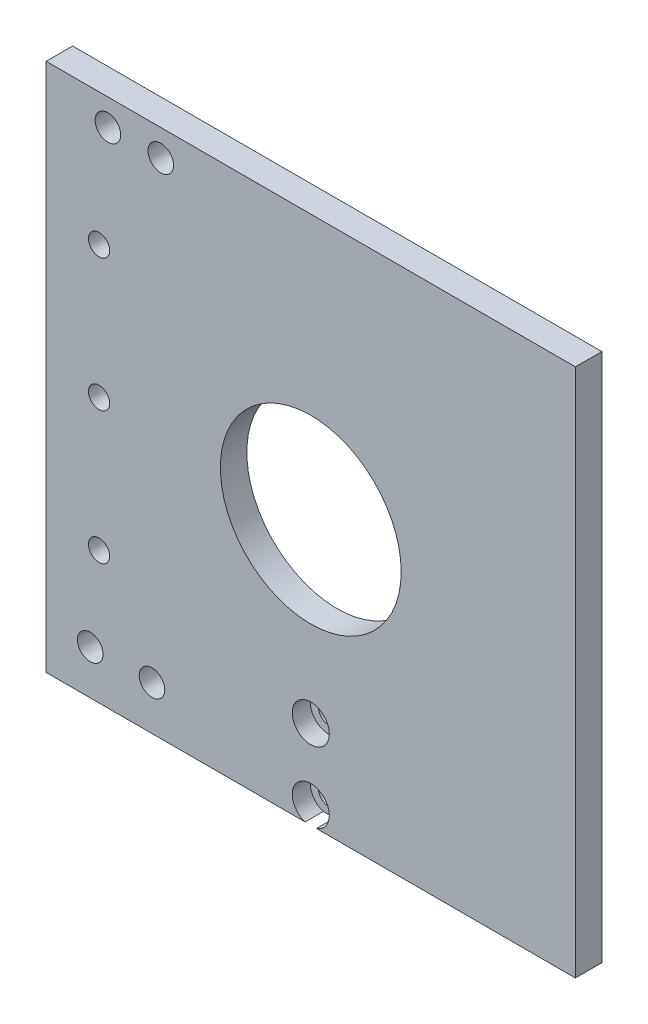
ISO-10303-21;
HEADER;
FILE_DESCRIPTION(('STEP AP214'),'2;1');
FILE_NAME('part.step','',(''),(''),'','','');
FILE_SCHEMA(('AUTOMOTIVE_DESIGN { 1 0 10303 214 1 1 1 1 }'));
ENDSEC;
DATA;
#1=APPLICATION_CONTEXT('core data for automotive mechanical design processes');
#2=APPLICATION_PROTOCOL_DEFINITION('international standard','automotive_design',2000,#1);
#3=PRODUCT_CONTEXT('',#1,'mechanical');
#4=PRODUCT('Part','Part','',(#3));
#5=PRODUCT_RELATED_PRODUCT_CATEGORY('part','',(#4));
#6=PRODUCT_DEFINITION_FORMATION('','',#4);
#7=PRODUCT_DEFINITION_CONTEXT('part definition',#1,'design');
#8=PRODUCT_DEFINITION('design','',#6,#7);
#9=PRODUCT_DEFINITION_SHAPE('','',#8);
#10=(LENGTH_UNIT() NAMED_UNIT(*) SI_UNIT(.MILLI.,.METRE.));
#11=(NAMED_UNIT(*) PLANE_ANGLE_UNIT() SI_UNIT($,.RADIAN.));
#12=(NAMED_UNIT(*) SI_UNIT($,.STERADIAN.) SOLID_ANGLE_UNIT());
#13=UNCERTAINTY_MEASURE_WITH_UNIT(LENGTH_MEASURE(1.E-05),#10,'distance_accuracy_value','');
#14=(GEOMETRIC_REPRESENTATION_CONTEXT(3) GLOBAL_UNCERTAINTY_ASSIGNED_CONTEXT((#13)) GLOBAL_UNIT_ASSIGNED_CONTEXT((#10,
#11,#12)) REPRESENTATION_CONTEXT('',''));
#15=CARTESIAN_POINT('',(0.,0.,0.));
#16=DIRECTION('',(0.,0.,1.));
#17=DIRECTION('',(1.,0.,0.));
#18=AXIS2_PLACEMENT_3D('',#15,#16,#17);
#19=CARTESIAN_POINT('',(1.11022302462516E-13,-20.,-0.01));
#20=DIRECTION('',(0.,0.,1.));
#21=DIRECTION('',(1.,0.,0.));
#22=AXIS2_PLACEMENT_3D('',#19,#20,#21);
#23=CYLINDRICAL_SURFACE('',#22,1.2);
#24=CARTESIAN_POINT('',(1.11022302462516E-13,-20.,0.));
#25=DIRECTION('',(0.,0.,1.));
#26=DIRECTION('',(1.,0.,0.));
#27=AXIS2_PLACEMENT_3D('',#24,#25,#26);
#28=CIRCLE('',#27,1.2);
#29=CARTESIAN_POINT('',(1.20000000000011,-20.,0.));
#30=VERTEX_POINT('',#29);
#31=EDGE_CURVE('E114',#30,#30,#28,.T.);
#32=ORIENTED_EDGE('',*,*,#31,.F.);
#33=EDGE_LOOP('',(#32));
#34=FACE_BOUND('',#33,.T.);
#35=CARTESIAN_POINT('',(1.11022302462516E-13,-20.,0.95));
#36=DIRECTION('',(0.,0.,1.));
#37=DIRECTION('',(1.,0.,0.));
#38=AXIS2_PLACEMENT_3D('',#35,#36,#37);
#39=CIRCLE('',#38,1.2);
#40=CARTESIAN_POINT('',(1.20000000000011,-20.,0.95));
#41=VERTEX_POINT('',#40);
#42=EDGE_CURVE('E43',#41,#41,#39,.F.);
#43=ORIENTED_EDGE('',*,*,#42,.F.);
#44=EDGE_LOOP('',(#43));
#45=FACE_BOUND('',#44,.T.);
#46=ADVANCED_FACE('F39',(#34,#45),#23,.F.);
#47=CARTESIAN_POINT('',(1.11022302462516E-13,-28.,-0.01));
#48=DIRECTION('',(0.,0.,1.));
#49=DIRECTION('',(1.,0.,0.));
#50=AXIS2_PLACEMENT_3D('',#47,#48,#49);
#51=CYLINDRICAL_SURFACE('',#50,1.2);
#52=CARTESIAN_POINT('',(1.11022302462516E-13,-28.,0.));
#53=DIRECTION('',(0.,0.,1.));
#54=DIRECTION('',(1.,0.,0.));
#55=AXIS2_PLACEMENT_3D('',#52,#53,#54);
#56=CIRCLE('',#55,1.2);
#57=CARTESIAN_POINT('',(1.20000000000011,-28.,0.));
#58=VERTEX_POINT('',#57);
#59=EDGE_CURVE('E160',#58,#58,#56,.T.);
#60=ORIENTED_EDGE('',*,*,#59,.F.);
#61=EDGE_LOOP('',(#60));
#62=FACE_BOUND('',#61,.T.);
#63=CARTESIAN_POINT('',(1.11022302462516E-13,-28.,0.95));
#64=DIRECTION('',(0.,0.,1.));
#65=DIRECTION('',(1.,0.,0.));
#66=AXIS2_PLACEMENT_3D('',#63,#64,#65);
#67=CIRCLE('',#66,1.2);
#68=CARTESIAN_POINT('',(1.20000000000011,-28.,0.95));
#69=VERTEX_POINT('',#68);
#70=EDGE_CURVE('E158',#69,#69,#67,.F.);
#71=ORIENTED_EDGE('',*,*,#70,.F.);
#72=EDGE_LOOP('',(#71));
#73=FACE_BOUND('',#72,.T.);
#74=ADVANCED_FACE('F229',(#62,#73),#51,.F.);
#75=CARTESIAN_POINT('',(-30.,-30.,3.));
#76=DIRECTION('',(1.,0.,0.));
#77=DIRECTION('',(0.,0.,-1.));
#78=AXIS2_PLACEMENT_3D('',#75,#76,#77);
#79=PLANE('',#78);
#80=DIRECTION('',(0.,-1.,0.));
#81=VECTOR('',#80,1.);
#82=CARTESIAN_POINT('',(-30.,-30.,0.));
#83=LINE('',#82,#81);
#84=CARTESIAN_POINT('',(-30.,30.,0.));
#85=VERTEX_POINT('',#84);
#86=CARTESIAN_POINT('',(-30.,-30.,0.));
#87=VERTEX_POINT('',#86);
#88=EDGE_CURVE('E129',#85,#87,#83,.T.);
#89=ORIENTED_EDGE('',*,*,#88,.T.);
#90=DIRECTION('',(0.,0.,-1.));
#91=VECTOR('',#90,1.);
#92=CARTESIAN_POINT('',(-30.,-30.,3.));
#93=LINE('',#92,#91);
#94=CARTESIAN_POINT('',(-30.,-30.,3.));
#95=VERTEX_POINT('',#94);
#96=EDGE_CURVE('E11',#95,#87,#93,.T.);
#97=ORIENTED_EDGE('',*,*,#96,.F.);
#98=DIRECTION('',(0.,-1.,0.));
#99=VECTOR('',#98,1.);
#100=CARTESIAN_POINT('',(-30.,-30.,3.));
#101=LINE('',#100,#99);
#102=CARTESIAN_POINT('',(-30.,30.,3.));
#103=VERTEX_POINT('',#102);
#104=EDGE_CURVE('E117',#103,#95,#101,.T.);
#105=ORIENTED_EDGE('',*,*,#104,.F.);
#106=DIRECTION('',(0.,0.,-1.));
#107=VECTOR('',#106,1.);
#108=CARTESIAN_POINT('',(-30.,30.,3.));
#109=LINE('',#108,#107);
#110=EDGE_CURVE('E128',#103,#85,#109,.T.);
#111=ORIENTED_EDGE('',*,*,#110,.T.);
#112=EDGE_LOOP('',(#89,#97,#105,#111));
#113=FACE_BOUND('',#112,.T.);
#114=ADVANCED_FACE('F41',(#113),#79,.F.);
#115=CARTESIAN_POINT('',(30.,-30.,3.));
#116=DIRECTION('',(0.,1.,0.));
#117=DIRECTION('',(-1.,0.,0.));
#118=AXIS2_PLACEMENT_3D('',#115,#116,#117);
#119=PLANE('',#118);
#120=DIRECTION('',(1.,0.,0.));
#121=VECTOR('',#120,1.);
#122=CARTESIAN_POINT('',(30.,-30.,0.95));
#123=LINE('',#122,#121);
#124=CARTESIAN_POINT('',(-0.640312423743276,-30.,0.95));
#125=VERTEX_POINT('',#124);
#126=CARTESIAN_POINT('',(0.640312423743498,-30.,0.95));
#127=VERTEX_POINT('',#126);
#128=EDGE_CURVE('E111',#125,#127,#123,.T.);
#129=ORIENTED_EDGE('',*,*,#128,.F.);
#130=DIRECTION('',(0.,0.,1.));
#131=VECTOR('',#130,1.);
#132=CARTESIAN_POINT('',(-0.640312423743276,-30.,0.95));
#133=LINE('',#132,#131);
#134=CARTESIAN_POINT('',(-0.640312423743276,-30.,3.));
#135=VERTEX_POINT('',#134);
#136=EDGE_CURVE('E102',#125,#135,#133,.T.);
#137=ORIENTED_EDGE('',*,*,#136,.T.);
#138=DIRECTION('',(1.,0.,0.));
#139=VECTOR('',#138,1.);
#140=CARTESIAN_POINT('',(30.,-30.,3.));
#141=LINE('',#140,#139);
#142=EDGE_CURVE('E95',#95,#135,#141,.T.);
#143=ORIENTED_EDGE('',*,*,#142,.F.);
#144=ORIENTED_EDGE('',*,*,#96,.T.);
#145=DIRECTION('',(1.,0.,0.));
#146=VECTOR('',#145,1.);
#147=CARTESIAN_POINT('',(30.,-30.,0.));
#148=LINE('',#147,#146);
#149=CARTESIAN_POINT('',(30.,-30.,0.));
#150=VERTEX_POINT('',#149);
#151=EDGE_CURVE('E134',#87,#150,#148,.T.);
#152=ORIENTED_EDGE('',*,*,#151,.T.);
#153=DIRECTION('',(0.,0.,-1.));
#154=VECTOR('',#153,1.);
#155=CARTESIAN_POINT('',(30.,-30.,3.));
#156=LINE('',#155,#154);
#157=CARTESIAN_POINT('',(30.,-30.,3.));
#158=VERTEX_POINT('',#157);
#159=EDGE_CURVE('E48',#158,#150,#156,.T.);
#160=ORIENTED_EDGE('',*,*,#159,.F.);
#161=CARTESIAN_POINT('',(0.640312423743498,-30.,3.));
#162=VERTEX_POINT('',#161);
#163=EDGE_CURVE('E125',#162,#158,#141,.T.);
#164=ORIENTED_EDGE('',*,*,#163,.F.);
#165=DIRECTION('',(0.,0.,1.));
#166=VECTOR('',#165,1.);
#167=CARTESIAN_POINT('',(0.640312423743498,-30.,0.95));
#168=LINE('',#167,#166);
#169=EDGE_CURVE('E106',#162,#127,#168,.F.);
#170=ORIENTED_EDGE('',*,*,#169,.T.);
#171=EDGE_LOOP('',(#129,#137,#143,#144,#152,#160,#164,#170));
#172=FACE_BOUND('',#171,.T.);
#173=ADVANCED_FACE('F115',(#172),#119,.F.);
#174=CARTESIAN_POINT('',(30.,-30.,3.));
#175=DIRECTION('',(-1.,0.,0.));
#176=DIRECTION('',(0.,0.,1.));
#177=AXIS2_PLACEMENT_3D('',#174,#175,#176);
#178=PLANE('',#177);
#179=DIRECTION('',(0.,1.,0.));
#180=VECTOR('',#179,1.);
#181=CARTESIAN_POINT('',(30.,-30.,0.));
#182=LINE('',#181,#180);
#183=CARTESIAN_POINT('',(30.,30.,0.));
#184=VERTEX_POINT('',#183);
#185=EDGE_CURVE('E136',#150,#184,#182,.T.);
#186=ORIENTED_EDGE('',*,*,#185,.T.);
#187=DIRECTION('',(0.,0.,-1.));
#188=VECTOR('',#187,1.);
#189=CARTESIAN_POINT('',(30.,30.,3.));
#190=LINE('',#189,#188);
#191=CARTESIAN_POINT('',(30.,30.,3.));
#192=VERTEX_POINT('',#191);
#193=EDGE_CURVE('E139',#192,#184,#190,.T.);
#194=ORIENTED_EDGE('',*,*,#193,.F.);
#195=DIRECTION('',(0.,1.,0.));
#196=VECTOR('',#195,1.);
#197=CARTESIAN_POINT('',(30.,-30.,3.));
#198=LINE('',#197,#196);
#199=EDGE_CURVE('E121',#158,#192,#198,.T.);
#200=ORIENTED_EDGE('',*,*,#199,.F.);
#201=ORIENTED_EDGE('',*,*,#159,.T.);
#202=EDGE_LOOP('',(#186,#194,#200,#201));
#203=FACE_BOUND('',#202,.T.);
#204=ADVANCED_FACE('F225',(#203),#178,.F.);
#205=CARTESIAN_POINT('',(30.,30.,3.));
#206=DIRECTION('',(0.,-1.,0.));
#207=DIRECTION('',(1.,0.,0.));
#208=AXIS2_PLACEMENT_3D('',#205,#206,#207);
#209=PLANE('',#208);
#210=DIRECTION('',(-1.,0.,0.));
#211=VECTOR('',#210,1.);
#212=CARTESIAN_POINT('',(30.,30.,0.));
#213=LINE('',#212,#211);
#214=EDGE_CURVE('E83',#184,#85,#213,.T.);
#215=ORIENTED_EDGE('',*,*,#214,.T.);
#216=ORIENTED_EDGE('',*,*,#110,.F.);
#217=DIRECTION('',(-1.,0.,0.));
#218=VECTOR('',#217,1.);
#219=CARTESIAN_POINT('',(30.,30.,3.));
#220=LINE('',#219,#218);
#221=EDGE_CURVE('E63',#192,#103,#220,.T.);
#222=ORIENTED_EDGE('',*,*,#221,.F.);
#223=ORIENTED_EDGE('',*,*,#193,.T.);
#224=EDGE_LOOP('',(#215,#216,#222,#223));
#225=FACE_BOUND('',#224,.T.);
#226=ADVANCED_FACE('F215',(#225),#209,.F.);
#227=CARTESIAN_POINT('',(0.,0.,3.));
#228=DIRECTION('',(0.,0.,1.));
#229=DIRECTION('',(1.,0.,0.));
#230=AXIS2_PLACEMENT_3D('',#227,#228,#229);
#231=PLANE('',#230);
#232=CARTESIAN_POINT('',(1.11022302462516E-13,-28.,3.));
#233=DIRECTION('',(0.,0.,1.));
#234=DIRECTION('',(1.,0.,0.));
#235=AXIS2_PLACEMENT_3D('',#232,#233,#234);
#236=CIRCLE('',#235,2.1);
#237=EDGE_CURVE('E105',#162,#135,#236,.T.);
#238=ORIENTED_EDGE('',*,*,#237,.F.);
#239=ORIENTED_EDGE('',*,*,#163,.T.);
#240=ORIENTED_EDGE('',*,*,#199,.T.);
#241=ORIENTED_EDGE('',*,*,#221,.T.);
#242=ORIENTED_EDGE('',*,*,#104,.T.);
#243=ORIENTED_EDGE('',*,*,#142,.T.);
#244=EDGE_LOOP('',(#238,#239,#240,#241,#242,#243));
#245=FACE_BOUND('',#244,.T.);
#246=CARTESIAN_POINT('',(1.11022302462516E-13,-20.,3.));
#247=DIRECTION('',(0.,0.,1.));
#248=DIRECTION('',(1.,0.,0.));
#249=AXIS2_PLACEMENT_3D('',#246,#247,#248);
#250=CIRCLE('',#249,2.1);
#251=CARTESIAN_POINT('',(2.10000000000011,-20.,3.));
#252=VERTEX_POINT('',#251);
#253=EDGE_CURVE('E109',#252,#252,#250,.T.);
#254=ORIENTED_EDGE('',*,*,#253,.F.);
#255=EDGE_LOOP('',(#254));
#256=FACE_BOUND('',#255,.T.);
#257=CARTESIAN_POINT('',(-24.0000000000001,-15.0000000000001,3.));
#258=DIRECTION('',(0.,0.,1.));
#259=DIRECTION('',(1.,0.,0.));
#260=AXIS2_PLACEMENT_3D('',#257,#258,#259);
#261=CIRCLE('',#260,1.2);
#262=CARTESIAN_POINT('',(-22.8000000000001,-15.0000000000001,3.));
#263=VERTEX_POINT('',#262);
#264=EDGE_CURVE('E147',#263,#263,#261,.T.);
#265=ORIENTED_EDGE('',*,*,#264,.F.);
#266=EDGE_LOOP('',(#265));
#267=FACE_BOUND('',#266,.T.);
#268=CARTESIAN_POINT('',(-24.0000000000001,0.,3.));
#269=DIRECTION('',(0.,0.,1.));
#270=DIRECTION('',(1.,0.,0.));
#271=AXIS2_PLACEMENT_3D('',#268,#269,#270);
#272=CIRCLE('',#271,1.2);
#273=CARTESIAN_POINT('',(-22.8000000000001,0.,3.));
#274=VERTEX_POINT('',#273);
#275=EDGE_CURVE('E174',#274,#274,#272,.T.);
#276=ORIENTED_EDGE('',*,*,#275,.F.);
#277=EDGE_LOOP('',(#276));
#278=FACE_BOUND('',#277,.T.);
#279=CARTESIAN_POINT('',(-24.0000000000001,14.9999999999999,3.));
#280=DIRECTION('',(0.,0.,1.));
#281=DIRECTION('',(1.,0.,0.));
#282=AXIS2_PLACEMENT_3D('',#279,#280,#281);
#283=CIRCLE('',#282,1.2);
#284=CARTESIAN_POINT('',(-22.8000000000001,14.9999999999999,3.));
#285=VERTEX_POINT('',#284);
#286=EDGE_CURVE('E159',#285,#285,#283,.T.);
#287=ORIENTED_EDGE('',*,*,#286,.F.);
#288=EDGE_LOOP('',(#287));
#289=FACE_BOUND('',#288,.T.);
#290=CARTESIAN_POINT('',(-17.,27.,3.));
#291=DIRECTION('',(0.,0.,-1.));
#292=DIRECTION('',(-1.,0.,0.));
#293=AXIS2_PLACEMENT_3D('',#290,#291,#292);
#294=CIRCLE('',#293,1.45);
#295=CARTESIAN_POINT('',(-18.45,27.,3.));
#296=VERTEX_POINT('',#295);
#297=EDGE_CURVE('E177',#296,#296,#294,.T.);
#298=ORIENTED_EDGE('',*,*,#297,.T.);
#299=EDGE_LOOP('',(#298));
#300=FACE_BOUND('',#299,.T.);
#301=CARTESIAN_POINT('',(-23.,27.,3.));
#302=DIRECTION('',(0.,0.,-1.));
#303=DIRECTION('',(-1.,0.,0.));
#304=AXIS2_PLACEMENT_3D('',#301,#302,#303);
#305=CIRCLE('',#304,1.45);
#306=CARTESIAN_POINT('',(-24.45,27.,3.));
#307=VERTEX_POINT('',#306);
#308=EDGE_CURVE('E153',#307,#307,#305,.T.);
#309=ORIENTED_EDGE('',*,*,#308,.T.);
#310=EDGE_LOOP('',(#309));
#311=FACE_BOUND('',#310,.T.);
#312=CARTESIAN_POINT('',(-17.9999999999999,-24.9999999999999,3.));
#313=DIRECTION('',(0.,0.,1.));
#314=DIRECTION('',(1.,0.,0.));
#315=AXIS2_PLACEMENT_3D('',#312,#313,#314);
#316=CIRCLE('',#315,1.45);
#317=CARTESIAN_POINT('',(-16.5499999999999,-24.9999999999999,3.));
#318=VERTEX_POINT('',#317);
#319=EDGE_CURVE('E199',#318,#318,#316,.T.);
#320=ORIENTED_EDGE('',*,*,#319,.F.);
#321=EDGE_LOOP('',(#320));
#322=FACE_BOUND('',#321,.T.);
#323=CARTESIAN_POINT('',(-24.9999999999999,-24.9999999999999,3.));
#324=DIRECTION('',(0.,0.,1.));
#325=DIRECTION('',(1.,0.,0.));
#326=AXIS2_PLACEMENT_3D('',#323,#324,#325);
#327=CIRCLE('',#326,1.45);
#328=CARTESIAN_POINT('',(-23.5499999999999,-24.9999999999999,3.));
#329=VERTEX_POINT('',#328);
#330=EDGE_CURVE('E194',#329,#329,#327,.T.);
#331=ORIENTED_EDGE('',*,*,#330,.F.);
#332=EDGE_LOOP('',(#331));
#333=FACE_BOUND('',#332,.T.);
#334=CARTESIAN_POINT('',(0.,0.,3.));
#335=DIRECTION('',(0.,0.,1.));
#336=DIRECTION('',(1.,0.,0.));
#337=AXIS2_PLACEMENT_3D('',#334,#335,#336);
#338=CIRCLE('',#337,10.25);
#339=CARTESIAN_POINT('',(10.25,0.,3.));
#340=VERTEX_POINT('',#339);
#341=EDGE_CURVE('E202',#340,#340,#338,.T.);
#342=ORIENTED_EDGE('',*,*,#341,.F.);
#343=EDGE_LOOP('',(#342));
#344=FACE_BOUND('',#343,.T.);
#345=ADVANCED_FACE('F116',(#245,#256,#267,#278,#289,#300,#311,#322,#333,#344),#231,.T.);
#346=CARTESIAN_POINT('',(0.,0.,0.));
#347=DIRECTION('',(0.,0.,1.));
#348=DIRECTION('',(1.,0.,0.));
#349=AXIS2_PLACEMENT_3D('',#346,#347,#348);
#350=PLANE('',#349);
#351=ORIENTED_EDGE('',*,*,#59,.T.);
#352=EDGE_LOOP('',(#351));
#353=FACE_BOUND('',#352,.T.);
#354=ORIENTED_EDGE('',*,*,#31,.T.);
#355=EDGE_LOOP('',(#354));
#356=FACE_BOUND('',#355,.T.);
#357=CARTESIAN_POINT('',(-24.0000000000001,-15.0000000000001,0.));
#358=DIRECTION('',(0.,0.,1.));
#359=DIRECTION('',(1.,0.,0.));
#360=AXIS2_PLACEMENT_3D('',#357,#358,#359);
#361=CIRCLE('',#360,1.2);
#362=CARTESIAN_POINT('',(-22.8000000000001,-15.0000000000001,0.));
#363=VERTEX_POINT('',#362);
#364=EDGE_CURVE('E154',#363,#363,#361,.T.);
#365=ORIENTED_EDGE('',*,*,#364,.T.);
#366=EDGE_LOOP('',(#365));
#367=FACE_BOUND('',#366,.T.);
#368=CARTESIAN_POINT('',(-24.0000000000001,0.,0.));
#369=DIRECTION('',(0.,0.,1.));
#370=DIRECTION('',(1.,0.,0.));
#371=AXIS2_PLACEMENT_3D('',#368,#369,#370);
#372=CIRCLE('',#371,1.2);
#373=CARTESIAN_POINT('',(-22.8000000000001,0.,0.));
#374=VERTEX_POINT('',#373);
#375=EDGE_CURVE('E150',#374,#374,#372,.T.);
#376=ORIENTED_EDGE('',*,*,#375,.T.);
#377=EDGE_LOOP('',(#376));
#378=FACE_BOUND('',#377,.T.);
#379=CARTESIAN_POINT('',(-24.0000000000001,14.9999999999999,0.));
#380=DIRECTION('',(0.,0.,1.));
#381=DIRECTION('',(1.,0.,0.));
#382=AXIS2_PLACEMENT_3D('',#379,#380,#381);
#383=CIRCLE('',#382,1.2);
#384=CARTESIAN_POINT('',(-22.8000000000001,14.9999999999999,0.));
#385=VERTEX_POINT('',#384);
#386=EDGE_CURVE('E144',#385,#385,#383,.T.);
#387=ORIENTED_EDGE('',*,*,#386,.T.);
#388=EDGE_LOOP('',(#387));
#389=FACE_BOUND('',#388,.T.);
#390=CARTESIAN_POINT('',(-17.,27.,0.));
#391=DIRECTION('',(0.,0.,-1.));
#392=DIRECTION('',(-1.,0.,0.));
#393=AXIS2_PLACEMENT_3D('',#390,#391,#392);
#394=CIRCLE('',#393,1.45);
#395=CARTESIAN_POINT('',(-18.45,27.,0.));
#396=VERTEX_POINT('',#395);
#397=EDGE_CURVE('E185',#396,#396,#394,.T.);
#398=ORIENTED_EDGE('',*,*,#397,.F.);
#399=EDGE_LOOP('',(#398));
#400=FACE_BOUND('',#399,.T.);
#401=CARTESIAN_POINT('',(-23.,27.,0.));
#402=DIRECTION('',(0.,0.,-1.));
#403=DIRECTION('',(-1.,0.,0.));
#404=AXIS2_PLACEMENT_3D('',#401,#402,#403);
#405=CIRCLE('',#404,1.45);
#406=CARTESIAN_POINT('',(-24.45,27.,0.));
#407=VERTEX_POINT('',#406);
#408=EDGE_CURVE('E190',#407,#407,#405,.T.);
#409=ORIENTED_EDGE('',*,*,#408,.F.);
#410=EDGE_LOOP('',(#409));
#411=FACE_BOUND('',#410,.T.);
#412=CARTESIAN_POINT('',(-17.9999999999999,-24.9999999999999,0.));
#413=DIRECTION('',(0.,0.,-1.));
#414=DIRECTION('',(-1.,0.,0.));
#415=AXIS2_PLACEMENT_3D('',#412,#413,#414);
#416=CIRCLE('',#415,1.45);
#417=CARTESIAN_POINT('',(-19.4499999999999,-24.9999999999999,0.));
#418=VERTEX_POINT('',#417);
#419=EDGE_CURVE('E195',#418,#418,#416,.T.);
#420=ORIENTED_EDGE('',*,*,#419,.F.);
#421=EDGE_LOOP('',(#420));
#422=FACE_BOUND('',#421,.T.);
#423=CARTESIAN_POINT('',(-24.9999999999999,-24.9999999999999,0.));
#424=DIRECTION('',(0.,0.,-1.));
#425=DIRECTION('',(-1.,0.,0.));
#426=AXIS2_PLACEMENT_3D('',#423,#424,#425);
#427=CIRCLE('',#426,1.45);
#428=CARTESIAN_POINT('',(-26.4499999999999,-24.9999999999999,0.));
#429=VERTEX_POINT('',#428);
#430=EDGE_CURVE('E181',#429,#429,#427,.T.);
#431=ORIENTED_EDGE('',*,*,#430,.F.);
#432=EDGE_LOOP('',(#431));
#433=FACE_BOUND('',#432,.T.);
#434=CARTESIAN_POINT('',(0.,0.,0.));
#435=DIRECTION('',(0.,0.,1.));
#436=DIRECTION('',(1.,0.,0.));
#437=AXIS2_PLACEMENT_3D('',#434,#435,#436);
#438=CIRCLE('',#437,10.25);
#439=CARTESIAN_POINT('',(10.25,0.,0.));
#440=VERTEX_POINT('',#439);
#441=EDGE_CURVE('E131',#440,#440,#438,.T.);
#442=ORIENTED_EDGE('',*,*,#441,.T.);
#443=EDGE_LOOP('',(#442));
#444=FACE_BOUND('',#443,.T.);
#445=ORIENTED_EDGE('',*,*,#88,.F.);
#446=ORIENTED_EDGE('',*,*,#214,.F.);
#447=ORIENTED_EDGE('',*,*,#185,.F.);
#448=ORIENTED_EDGE('',*,*,#151,.F.);
#449=EDGE_LOOP('',(#445,#446,#447,#448));
#450=FACE_BOUND('',#449,.T.);
#451=ADVANCED_FACE('F211',(#353,#356,#367,#378,#389,#400,#411,#422,#433,#444,#450),#350,.F.);
#452=CARTESIAN_POINT('',(0.,0.,0.));
#453=DIRECTION('',(0.,0.,1.));
#454=DIRECTION('',(1.,0.,0.));
#455=AXIS2_PLACEMENT_3D('',#452,#453,#454);
#456=CYLINDRICAL_SURFACE('',#455,10.25);
#457=ORIENTED_EDGE('',*,*,#441,.F.);
#458=EDGE_LOOP('',(#457));
#459=FACE_BOUND('',#458,.T.);
#460=ORIENTED_EDGE('',*,*,#341,.T.);
#461=EDGE_LOOP('',(#460));
#462=FACE_BOUND('',#461,.T.);
#463=ADVANCED_FACE('F209',(#459,#462),#456,.F.);
#464=CARTESIAN_POINT('',(-24.9999999999999,-24.9999999999999,3.01));
#465=DIRECTION('',(0.,0.,-1.));
#466=DIRECTION('',(-1.,0.,0.));
#467=AXIS2_PLACEMENT_3D('',#464,#465,#466);
#468=CYLINDRICAL_SURFACE('',#467,1.45);
#469=ORIENTED_EDGE('',*,*,#330,.T.);
#470=EDGE_LOOP('',(#469));
#471=FACE_BOUND('',#470,.T.);
#472=ORIENTED_EDGE('',*,*,#430,.T.);
#473=EDGE_LOOP('',(#472));
#474=FACE_BOUND('',#473,.T.);
#475=ADVANCED_FACE('F263',(#471,#474),#468,.F.);
#476=CARTESIAN_POINT('',(-17.9999999999999,-24.9999999999999,3.01));
#477=DIRECTION('',(0.,0.,-1.));
#478=DIRECTION('',(-1.,0.,0.));
#479=AXIS2_PLACEMENT_3D('',#476,#477,#478);
#480=CYLINDRICAL_SURFACE('',#479,1.45);
#481=ORIENTED_EDGE('',*,*,#319,.T.);
#482=EDGE_LOOP('',(#481));
#483=FACE_BOUND('',#482,.T.);
#484=ORIENTED_EDGE('',*,*,#419,.T.);
#485=EDGE_LOOP('',(#484));
#486=FACE_BOUND('',#485,.T.);
#487=ADVANCED_FACE('F257',(#483,#486),#480,.F.);
#488=CARTESIAN_POINT('',(-23.,27.,3.));
#489=DIRECTION('',(0.,0.,-1.));
#490=DIRECTION('',(-1.,0.,0.));
#491=AXIS2_PLACEMENT_3D('',#488,#489,#490);
#492=CYLINDRICAL_SURFACE('',#491,1.45);
#493=ORIENTED_EDGE('',*,*,#308,.F.);
#494=EDGE_LOOP('',(#493));
#495=FACE_BOUND('',#494,.T.);
#496=ORIENTED_EDGE('',*,*,#408,.T.);
#497=EDGE_LOOP('',(#496));
#498=FACE_BOUND('',#497,.T.);
#499=ADVANCED_FACE('F255',(#495,#498),#492,.F.);
#500=CARTESIAN_POINT('',(-17.,27.,3.));
#501=DIRECTION('',(0.,0.,-1.));
#502=DIRECTION('',(-1.,0.,0.));
#503=AXIS2_PLACEMENT_3D('',#500,#501,#502);
#504=CYLINDRICAL_SURFACE('',#503,1.45);
#505=ORIENTED_EDGE('',*,*,#297,.F.);
#506=EDGE_LOOP('',(#505));
#507=FACE_BOUND('',#506,.T.);
#508=ORIENTED_EDGE('',*,*,#397,.T.);
#509=EDGE_LOOP('',(#508));
#510=FACE_BOUND('',#509,.T.);
#511=ADVANCED_FACE('F248',(#507,#510),#504,.F.);
#512=CARTESIAN_POINT('',(-24.0000000000001,14.9999999999999,-0.01));
#513=DIRECTION('',(0.,0.,1.));
#514=DIRECTION('',(1.,0.,0.));
#515=AXIS2_PLACEMENT_3D('',#512,#513,#514);
#516=CYLINDRICAL_SURFACE('',#515,1.2);
#517=ORIENTED_EDGE('',*,*,#286,.T.);
#518=EDGE_LOOP('',(#517));
#519=FACE_BOUND('',#518,.T.);
#520=ORIENTED_EDGE('',*,*,#386,.F.);
#521=EDGE_LOOP('',(#520));
#522=FACE_BOUND('',#521,.T.);
#523=ADVANCED_FACE('F241',(#519,#522),#516,.F.);
#524=CARTESIAN_POINT('',(-24.0000000000001,0.,-0.01));
#525=DIRECTION('',(0.,0.,1.));
#526=DIRECTION('',(1.,0.,0.));
#527=AXIS2_PLACEMENT_3D('',#524,#525,#526);
#528=CYLINDRICAL_SURFACE('',#527,1.2);
#529=ORIENTED_EDGE('',*,*,#275,.T.);
#530=EDGE_LOOP('',(#529));
#531=FACE_BOUND('',#530,.T.);
#532=ORIENTED_EDGE('',*,*,#375,.F.);
#533=EDGE_LOOP('',(#532));
#534=FACE_BOUND('',#533,.T.);
#535=ADVANCED_FACE('F242',(#531,#534),#528,.F.);
#536=CARTESIAN_POINT('',(-24.0000000000001,-15.0000000000001,-0.01));
#537=DIRECTION('',(0.,0.,1.));
#538=DIRECTION('',(1.,0.,0.));
#539=AXIS2_PLACEMENT_3D('',#536,#537,#538);
#540=CYLINDRICAL_SURFACE('',#539,1.2);
#541=ORIENTED_EDGE('',*,*,#264,.T.);
#542=EDGE_LOOP('',(#541));
#543=FACE_BOUND('',#542,.T.);
#544=ORIENTED_EDGE('',*,*,#364,.F.);
#545=EDGE_LOOP('',(#544));
#546=FACE_BOUND('',#545,.T.);
#547=ADVANCED_FACE('F237',(#543,#546),#540,.F.);
#548=CARTESIAN_POINT('',(1.11022302462516E-13,-28.,0.95));
#549=DIRECTION('',(0.,0.,1.));
#550=DIRECTION('',(1.,0.,0.));
#551=AXIS2_PLACEMENT_3D('',#548,#549,#550);
#552=CYLINDRICAL_SURFACE('',#551,2.1);
#553=CARTESIAN_POINT('',(1.11022302462516E-13,-28.,0.95));
#554=DIRECTION('',(0.,0.,1.));
#555=DIRECTION('',(1.,0.,0.));
#556=AXIS2_PLACEMENT_3D('',#553,#554,#555);
#557=CIRCLE('',#556,2.1);
#558=EDGE_CURVE('E54',#127,#125,#557,.T.);
#559=ORIENTED_EDGE('',*,*,#558,.F.);
#560=ORIENTED_EDGE('',*,*,#169,.F.);
#561=ORIENTED_EDGE('',*,*,#237,.T.);
#562=ORIENTED_EDGE('',*,*,#136,.F.);
#563=EDGE_LOOP('',(#559,#560,#561,#562));
#564=FACE_BOUND('',#563,.T.);
#565=ADVANCED_FACE('F103',(#564),#552,.F.);
#566=CARTESIAN_POINT('',(1.11022302462516E-13,-28.,0.95));
#567=DIRECTION('',(0.,0.,1.));
#568=DIRECTION('',(1.,0.,0.));
#569=AXIS2_PLACEMENT_3D('',#566,#567,#568);
#570=PLANE('',#569);
#571=ORIENTED_EDGE('',*,*,#70,.T.);
#572=EDGE_LOOP('',(#571));
#573=FACE_BOUND('',#572,.T.);
#574=ORIENTED_EDGE('',*,*,#128,.T.);
#575=ORIENTED_EDGE('',*,*,#558,.T.);
#576=EDGE_LOOP('',(#574,#575));
#577=FACE_BOUND('',#576,.T.);
#578=ADVANCED_FACE('F379',(#573,#577),#570,.T.);
#579=CARTESIAN_POINT('',(1.11022302462516E-13,-20.,0.95));
#580=DIRECTION('',(0.,0.,1.));
#581=DIRECTION('',(1.,0.,0.));
#582=AXIS2_PLACEMENT_3D('',#579,#580,#581);
#583=PLANE('',#582);
#584=CARTESIAN_POINT('',(1.11022302462516E-13,-20.,0.95));
#585=DIRECTION('',(0.,0.,1.));
#586=DIRECTION('',(1.,0.,0.));
#587=AXIS2_PLACEMENT_3D('',#584,#585,#586);
#588=CIRCLE('',#587,2.1);
#589=CARTESIAN_POINT('',(2.10000000000011,-20.,0.95));
#590=VERTEX_POINT('',#589);
#591=EDGE_CURVE('E169',#590,#590,#588,.T.);
#592=ORIENTED_EDGE('',*,*,#591,.T.);
#593=EDGE_LOOP('',(#592));
#594=FACE_BOUND('',#593,.T.);
#595=ORIENTED_EDGE('',*,*,#42,.T.);
#596=EDGE_LOOP('',(#595));
#597=FACE_BOUND('',#596,.T.);
#598=ADVANCED_FACE('F383',(#594,#597),#583,.T.);
#599=CARTESIAN_POINT('',(1.11022302462516E-13,-20.,0.95));
#600=DIRECTION('',(0.,0.,1.));
#601=DIRECTION('',(1.,0.,0.));
#602=AXIS2_PLACEMENT_3D('',#599,#600,#601);
#603=CYLINDRICAL_SURFACE('',#602,2.1);
#604=ORIENTED_EDGE('',*,*,#591,.F.);
#605=EDGE_LOOP('',(#604));
#606=FACE_BOUND('',#605,.T.);
#607=ORIENTED_EDGE('',*,*,#253,.T.);
#608=EDGE_LOOP('',(#607));
#609=FACE_BOUND('',#608,.T.);
#610=ADVANCED_FACE('F394',(#606,#609),#603,.F.);
#611=CLOSED_SHELL('',(#46,#74,#114,#173,#204,#226,#345,#451,#463,#475,#487,#499,#511,#523,#535,
#547,#565,#578,#598,#610));
#612=MANIFOLD_SOLID_BREP('B2',#611);
#613=ADVANCED_BREP_SHAPE_REPRESENTATION('',(#18,#612),#14);
#614=SHAPE_DEFINITION_REPRESENTATION(#9,#613);
ENDSEC;
END-ISO-10303-21;
